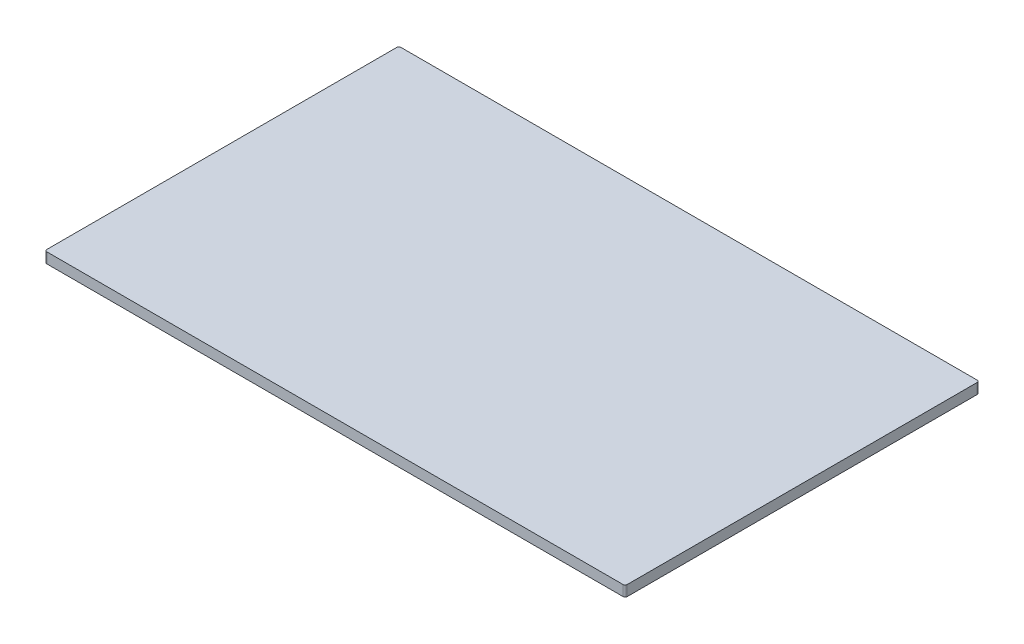
ISO-10303-21;
HEADER;
FILE_DESCRIPTION(('STEP AP214'),'2;1');
FILE_NAME('part.step','',(''),(''),'','','');
FILE_SCHEMA(('AUTOMOTIVE_DESIGN { 1 0 10303 214 1 1 1 1 }'));
ENDSEC;
DATA;
#1=APPLICATION_CONTEXT('core data for automotive mechanical design processes');
#2=APPLICATION_PROTOCOL_DEFINITION('international standard','automotive_design',2000,#1);
#3=PRODUCT_CONTEXT('',#1,'mechanical');
#4=PRODUCT('Part','Part','',(#3));
#5=PRODUCT_RELATED_PRODUCT_CATEGORY('part','',(#4));
#6=PRODUCT_DEFINITION_FORMATION('','',#4);
#7=PRODUCT_DEFINITION_CONTEXT('part definition',#1,'design');
#8=PRODUCT_DEFINITION('design','',#6,#7);
#9=PRODUCT_DEFINITION_SHAPE('','',#8);
#10=(LENGTH_UNIT() NAMED_UNIT(*) SI_UNIT(.MILLI.,.METRE.));
#11=(NAMED_UNIT(*) PLANE_ANGLE_UNIT() SI_UNIT($,.RADIAN.));
#12=(NAMED_UNIT(*) SI_UNIT($,.STERADIAN.) SOLID_ANGLE_UNIT());
#13=UNCERTAINTY_MEASURE_WITH_UNIT(LENGTH_MEASURE(1.E-05),#10,'distance_accuracy_value','');
#14=(GEOMETRIC_REPRESENTATION_CONTEXT(3) GLOBAL_UNCERTAINTY_ASSIGNED_CONTEXT((#13)) GLOBAL_UNIT_ASSIGNED_CONTEXT((#10,
#11,#12)) REPRESENTATION_CONTEXT('',''));
#15=CARTESIAN_POINT('',(0.,0.,0.));
#16=DIRECTION('',(0.,0.,1.));
#17=DIRECTION('',(1.,0.,0.));
#18=AXIS2_PLACEMENT_3D('',#15,#16,#17);
#19=CARTESIAN_POINT('',(-277.,10.,169.));
#20=DIRECTION('',(1.,0.,0.));
#21=DIRECTION('',(0.,0.,-1.));
#22=AXIS2_PLACEMENT_3D('',#19,#20,#21);
#23=PLANE('',#22);
#24=DIRECTION('',(0.,0.,1.));
#25=VECTOR('',#24,1.);
#26=CARTESIAN_POINT('',(-277.,10.,169.));
#27=LINE('',#26,#25);
#28=CARTESIAN_POINT('',(-277.,10.,-167.));
#29=VERTEX_POINT('',#28);
#30=CARTESIAN_POINT('',(-277.,10.,167.));
#31=VERTEX_POINT('',#30);
#32=EDGE_CURVE('E123',#29,#31,#27,.T.);
#33=ORIENTED_EDGE('',*,*,#32,.F.);
#34=DIRECTION('',(0.,-1.,0.));
#35=VECTOR('',#34,1.);
#36=CARTESIAN_POINT('',(-277.,10.,-167.));
#37=LINE('',#36,#35);
#38=CARTESIAN_POINT('',(-277.,0.,-167.));
#39=VERTEX_POINT('',#38);
#40=EDGE_CURVE('E108',#29,#39,#37,.T.);
#41=ORIENTED_EDGE('',*,*,#40,.T.);
#42=DIRECTION('',(0.,0.,1.));
#43=VECTOR('',#42,1.);
#44=CARTESIAN_POINT('',(-277.,0.,169.));
#45=LINE('',#44,#43);
#46=CARTESIAN_POINT('',(-277.,0.,167.));
#47=VERTEX_POINT('',#46);
#48=EDGE_CURVE('E120',#39,#47,#45,.T.);
#49=ORIENTED_EDGE('',*,*,#48,.T.);
#50=DIRECTION('',(0.,-1.,0.));
#51=VECTOR('',#50,1.);
#52=CARTESIAN_POINT('',(-277.,10.,167.));
#53=LINE('',#52,#51);
#54=EDGE_CURVE('E125',#47,#31,#53,.F.);
#55=ORIENTED_EDGE('',*,*,#54,.T.);
#56=EDGE_LOOP('',(#33,#41,#49,#55));
#57=FACE_BOUND('',#56,.T.);
#58=ADVANCED_FACE('F38',(#57),#23,.F.);
#59=CARTESIAN_POINT('',(277.,10.,169.));
#60=DIRECTION('',(0.,0.,-1.));
#61=DIRECTION('',(-1.,0.,0.));
#62=AXIS2_PLACEMENT_3D('',#59,#60,#61);
#63=PLANE('',#62);
#64=DIRECTION('',(1.,0.,0.));
#65=VECTOR('',#64,1.);
#66=CARTESIAN_POINT('',(277.,0.,169.));
#67=LINE('',#66,#65);
#68=CARTESIAN_POINT('',(-275.,0.,169.));
#69=VERTEX_POINT('',#68);
#70=CARTESIAN_POINT('',(275.,0.,169.));
#71=VERTEX_POINT('',#70);
#72=EDGE_CURVE('E129',#69,#71,#67,.T.);
#73=ORIENTED_EDGE('',*,*,#72,.T.);
#74=DIRECTION('',(0.,-1.,0.));
#75=VECTOR('',#74,1.);
#76=CARTESIAN_POINT('',(275.,10.,169.));
#77=LINE('',#76,#75);
#78=CARTESIAN_POINT('',(275.,10.,169.));
#79=VERTEX_POINT('',#78);
#80=EDGE_CURVE('E12',#71,#79,#77,.F.);
#81=ORIENTED_EDGE('',*,*,#80,.T.);
#82=DIRECTION('',(1.,0.,0.));
#83=VECTOR('',#82,1.);
#84=CARTESIAN_POINT('',(277.,10.,169.));
#85=LINE('',#84,#83);
#86=CARTESIAN_POINT('',(-275.,10.,169.));
#87=VERTEX_POINT('',#86);
#88=EDGE_CURVE('E162',#87,#79,#85,.T.);
#89=ORIENTED_EDGE('',*,*,#88,.F.);
#90=DIRECTION('',(0.,-1.,0.));
#91=VECTOR('',#90,1.);
#92=CARTESIAN_POINT('',(-275.,10.,169.));
#93=LINE('',#92,#91);
#94=EDGE_CURVE('E46',#87,#69,#93,.T.);
#95=ORIENTED_EDGE('',*,*,#94,.T.);
#96=EDGE_LOOP('',(#73,#81,#89,#95));
#97=FACE_BOUND('',#96,.T.);
#98=ADVANCED_FACE('F194',(#97),#63,.F.);
#99=CARTESIAN_POINT('',(277.,10.,169.));
#100=DIRECTION('',(-1.,0.,0.));
#101=DIRECTION('',(0.,0.,1.));
#102=AXIS2_PLACEMENT_3D('',#99,#100,#101);
#103=PLANE('',#102);
#104=DIRECTION('',(0.,0.,-1.));
#105=VECTOR('',#104,1.);
#106=CARTESIAN_POINT('',(277.,0.,169.));
#107=LINE('',#106,#105);
#108=CARTESIAN_POINT('',(277.,0.,167.));
#109=VERTEX_POINT('',#108);
#110=CARTESIAN_POINT('',(277.,0.,-167.));
#111=VERTEX_POINT('',#110);
#112=EDGE_CURVE('E132',#109,#111,#107,.T.);
#113=ORIENTED_EDGE('',*,*,#112,.T.);
#114=DIRECTION('',(0.,-1.,0.));
#115=VECTOR('',#114,1.);
#116=CARTESIAN_POINT('',(277.,10.,-167.));
#117=LINE('',#116,#115);
#118=CARTESIAN_POINT('',(277.,10.,-167.));
#119=VERTEX_POINT('',#118);
#120=EDGE_CURVE('E53',#111,#119,#117,.F.);
#121=ORIENTED_EDGE('',*,*,#120,.T.);
#122=DIRECTION('',(0.,0.,-1.));
#123=VECTOR('',#122,1.);
#124=CARTESIAN_POINT('',(277.,10.,169.));
#125=LINE('',#124,#123);
#126=CARTESIAN_POINT('',(277.,10.,167.));
#127=VERTEX_POINT('',#126);
#128=EDGE_CURVE('E165',#127,#119,#125,.T.);
#129=ORIENTED_EDGE('',*,*,#128,.F.);
#130=DIRECTION('',(0.,-1.,0.));
#131=VECTOR('',#130,1.);
#132=CARTESIAN_POINT('',(277.,10.,167.));
#133=LINE('',#132,#131);
#134=EDGE_CURVE('E181',#127,#109,#133,.T.);
#135=ORIENTED_EDGE('',*,*,#134,.T.);
#136=EDGE_LOOP('',(#113,#121,#129,#135));
#137=FACE_BOUND('',#136,.T.);
#138=ADVANCED_FACE('F202',(#137),#103,.F.);
#139=CARTESIAN_POINT('',(277.,10.,-169.));
#140=DIRECTION('',(0.,0.,1.));
#141=DIRECTION('',(1.,0.,0.));
#142=AXIS2_PLACEMENT_3D('',#139,#140,#141);
#143=PLANE('',#142);
#144=DIRECTION('',(-1.,0.,0.));
#145=VECTOR('',#144,1.);
#146=CARTESIAN_POINT('',(277.,0.,-169.));
#147=LINE('',#146,#145);
#148=CARTESIAN_POINT('',(275.,0.,-169.));
#149=VERTEX_POINT('',#148);
#150=CARTESIAN_POINT('',(-275.,0.,-169.));
#151=VERTEX_POINT('',#150);
#152=EDGE_CURVE('E140',#149,#151,#147,.T.);
#153=ORIENTED_EDGE('',*,*,#152,.T.);
#154=DIRECTION('',(0.,-1.,0.));
#155=VECTOR('',#154,1.);
#156=CARTESIAN_POINT('',(-275.,10.,-169.));
#157=LINE('',#156,#155);
#158=CARTESIAN_POINT('',(-275.,10.,-169.));
#159=VERTEX_POINT('',#158);
#160=EDGE_CURVE('E109',#151,#159,#157,.F.);
#161=ORIENTED_EDGE('',*,*,#160,.T.);
#162=DIRECTION('',(-1.,0.,0.));
#163=VECTOR('',#162,1.);
#164=CARTESIAN_POINT('',(277.,10.,-169.));
#165=LINE('',#164,#163);
#166=CARTESIAN_POINT('',(275.,10.,-169.));
#167=VERTEX_POINT('',#166);
#168=EDGE_CURVE('E135',#167,#159,#165,.T.);
#169=ORIENTED_EDGE('',*,*,#168,.F.);
#170=DIRECTION('',(0.,-1.,0.));
#171=VECTOR('',#170,1.);
#172=CARTESIAN_POINT('',(275.,10.,-169.));
#173=LINE('',#172,#171);
#174=EDGE_CURVE('E114',#167,#149,#173,.T.);
#175=ORIENTED_EDGE('',*,*,#174,.T.);
#176=EDGE_LOOP('',(#153,#161,#169,#175));
#177=FACE_BOUND('',#176,.T.);
#178=ADVANCED_FACE('F205',(#177),#143,.F.);
#179=CARTESIAN_POINT('',(0.,10.,0.));
#180=DIRECTION('',(0.,1.,0.));
#181=DIRECTION('',(0.,0.,1.));
#182=AXIS2_PLACEMENT_3D('',#179,#180,#181);
#183=PLANE('',#182);
#184=ORIENTED_EDGE('',*,*,#168,.T.);
#185=CARTESIAN_POINT('',(-275.,10.,-167.));
#186=DIRECTION('',(0.,1.,0.));
#187=DIRECTION('',(0.,0.,1.));
#188=AXIS2_PLACEMENT_3D('',#185,#186,#187);
#189=CIRCLE('',#188,2.);
#190=EDGE_CURVE('E177',#159,#29,#189,.T.);
#191=ORIENTED_EDGE('',*,*,#190,.T.);
#192=ORIENTED_EDGE('',*,*,#32,.T.);
#193=CARTESIAN_POINT('',(-275.,10.,167.));
#194=DIRECTION('',(0.,1.,0.));
#195=DIRECTION('',(0.,0.,1.));
#196=AXIS2_PLACEMENT_3D('',#193,#194,#195);
#197=CIRCLE('',#196,2.);
#198=EDGE_CURVE('E150',#31,#87,#197,.T.);
#199=ORIENTED_EDGE('',*,*,#198,.T.);
#200=ORIENTED_EDGE('',*,*,#88,.T.);
#201=CARTESIAN_POINT('',(275.,10.,167.));
#202=DIRECTION('',(0.,1.,0.));
#203=DIRECTION('',(0.,0.,1.));
#204=AXIS2_PLACEMENT_3D('',#201,#202,#203);
#205=CIRCLE('',#204,2.);
#206=EDGE_CURVE('E60',#79,#127,#205,.T.);
#207=ORIENTED_EDGE('',*,*,#206,.T.);
#208=ORIENTED_EDGE('',*,*,#128,.T.);
#209=CARTESIAN_POINT('',(275.,10.,-167.));
#210=DIRECTION('',(0.,1.,0.));
#211=DIRECTION('',(0.,0.,1.));
#212=AXIS2_PLACEMENT_3D('',#209,#210,#211);
#213=CIRCLE('',#212,2.);
#214=EDGE_CURVE('E178',#119,#167,#213,.T.);
#215=ORIENTED_EDGE('',*,*,#214,.T.);
#216=EDGE_LOOP('',(#184,#191,#192,#199,#200,#207,#208,#215));
#217=FACE_BOUND('',#216,.T.);
#218=ADVANCED_FACE('F176',(#217),#183,.T.);
#219=CARTESIAN_POINT('',(0.,0.,0.));
#220=DIRECTION('',(0.,1.,0.));
#221=DIRECTION('',(0.,0.,1.));
#222=AXIS2_PLACEMENT_3D('',#219,#220,#221);
#223=PLANE('',#222);
#224=ORIENTED_EDGE('',*,*,#48,.F.);
#225=CARTESIAN_POINT('',(-275.,0.,-167.));
#226=DIRECTION('',(0.,1.,0.));
#227=DIRECTION('',(0.,0.,1.));
#228=AXIS2_PLACEMENT_3D('',#225,#226,#227);
#229=CIRCLE('',#228,2.);
#230=EDGE_CURVE('E104',#39,#151,#229,.F.);
#231=ORIENTED_EDGE('',*,*,#230,.T.);
#232=ORIENTED_EDGE('',*,*,#152,.F.);
#233=CARTESIAN_POINT('',(275.,0.,-167.));
#234=DIRECTION('',(0.,1.,0.));
#235=DIRECTION('',(0.,0.,1.));
#236=AXIS2_PLACEMENT_3D('',#233,#234,#235);
#237=CIRCLE('',#236,2.);
#238=EDGE_CURVE('E115',#149,#111,#237,.F.);
#239=ORIENTED_EDGE('',*,*,#238,.T.);
#240=ORIENTED_EDGE('',*,*,#112,.F.);
#241=CARTESIAN_POINT('',(275.,0.,167.));
#242=DIRECTION('',(0.,1.,0.));
#243=DIRECTION('',(0.,0.,1.));
#244=AXIS2_PLACEMENT_3D('',#241,#242,#243);
#245=CIRCLE('',#244,2.);
#246=EDGE_CURVE('E144',#109,#71,#245,.F.);
#247=ORIENTED_EDGE('',*,*,#246,.T.);
#248=ORIENTED_EDGE('',*,*,#72,.F.);
#249=CARTESIAN_POINT('',(-275.,0.,167.));
#250=DIRECTION('',(0.,1.,0.));
#251=DIRECTION('',(0.,0.,1.));
#252=AXIS2_PLACEMENT_3D('',#249,#250,#251);
#253=CIRCLE('',#252,2.);
#254=EDGE_CURVE('E124',#69,#47,#253,.F.);
#255=ORIENTED_EDGE('',*,*,#254,.T.);
#256=EDGE_LOOP('',(#224,#231,#232,#239,#240,#247,#248,#255));
#257=FACE_BOUND('',#256,.T.);
#258=ADVANCED_FACE('F127',(#257),#223,.F.);
#259=CARTESIAN_POINT('',(-275.,10.,-167.));
#260=DIRECTION('',(0.,-1.,0.));
#261=DIRECTION('',(0.,0.,-1.));
#262=AXIS2_PLACEMENT_3D('',#259,#260,#261);
#263=CYLINDRICAL_SURFACE('',#262,2.);
#264=ORIENTED_EDGE('',*,*,#190,.F.);
#265=ORIENTED_EDGE('',*,*,#160,.F.);
#266=ORIENTED_EDGE('',*,*,#230,.F.);
#267=ORIENTED_EDGE('',*,*,#40,.F.);
#268=EDGE_LOOP('',(#264,#265,#266,#267));
#269=FACE_BOUND('',#268,.T.);
#270=ADVANCED_FACE('F107',(#269),#263,.T.);
#271=CARTESIAN_POINT('',(275.,10.,-167.));
#272=DIRECTION('',(0.,-1.,0.));
#273=DIRECTION('',(0.,0.,-1.));
#274=AXIS2_PLACEMENT_3D('',#271,#272,#273);
#275=CYLINDRICAL_SURFACE('',#274,2.);
#276=ORIENTED_EDGE('',*,*,#214,.F.);
#277=ORIENTED_EDGE('',*,*,#120,.F.);
#278=ORIENTED_EDGE('',*,*,#238,.F.);
#279=ORIENTED_EDGE('',*,*,#174,.F.);
#280=EDGE_LOOP('',(#276,#277,#278,#279));
#281=FACE_BOUND('',#280,.T.);
#282=ADVANCED_FACE('F204',(#281),#275,.T.);
#283=CARTESIAN_POINT('',(275.,10.,167.));
#284=DIRECTION('',(0.,-1.,0.));
#285=DIRECTION('',(0.,0.,-1.));
#286=AXIS2_PLACEMENT_3D('',#283,#284,#285);
#287=CYLINDRICAL_SURFACE('',#286,2.);
#288=ORIENTED_EDGE('',*,*,#206,.F.);
#289=ORIENTED_EDGE('',*,*,#80,.F.);
#290=ORIENTED_EDGE('',*,*,#246,.F.);
#291=ORIENTED_EDGE('',*,*,#134,.F.);
#292=EDGE_LOOP('',(#288,#289,#290,#291));
#293=FACE_BOUND('',#292,.T.);
#294=ADVANCED_FACE('F201',(#293),#287,.T.);
#295=CARTESIAN_POINT('',(-275.,10.,167.));
#296=DIRECTION('',(0.,-1.,0.));
#297=DIRECTION('',(0.,0.,-1.));
#298=AXIS2_PLACEMENT_3D('',#295,#296,#297);
#299=CYLINDRICAL_SURFACE('',#298,2.);
#300=ORIENTED_EDGE('',*,*,#198,.F.);
#301=ORIENTED_EDGE('',*,*,#54,.F.);
#302=ORIENTED_EDGE('',*,*,#254,.F.);
#303=ORIENTED_EDGE('',*,*,#94,.F.);
#304=EDGE_LOOP('',(#300,#301,#302,#303));
#305=FACE_BOUND('',#304,.T.);
#306=ADVANCED_FACE('F40',(#305),#299,.T.);
#307=CLOSED_SHELL('',(#58,#98,#138,#178,#218,#258,#270,#282,#294,#306));
#308=MANIFOLD_SOLID_BREP('B2',#307);
#309=ADVANCED_BREP_SHAPE_REPRESENTATION('',(#18,#308),#14);
#310=SHAPE_DEFINITION_REPRESENTATION(#9,#309);
ENDSEC;
END-ISO-10303-21;
